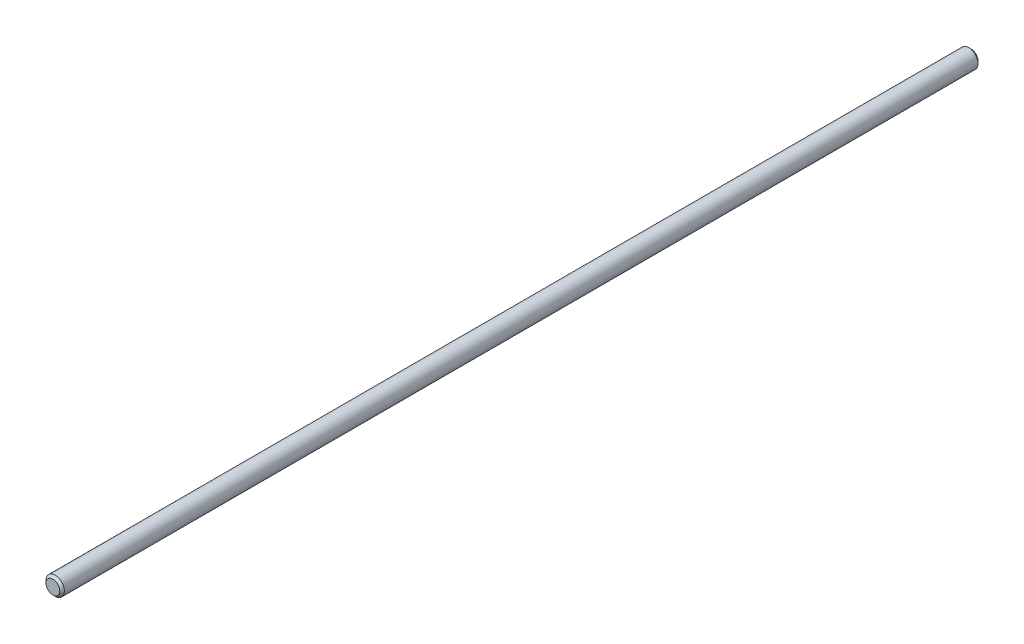
ISO-10303-21;
HEADER;
FILE_DESCRIPTION(('STEP AP214'),'2;1');
FILE_NAME('part.step','',(''),(''),'','','');
FILE_SCHEMA(('AUTOMOTIVE_DESIGN { 1 0 10303 214 1 1 1 1 }'));
ENDSEC;
DATA;
#1=APPLICATION_CONTEXT('core data for automotive mechanical design processes');
#2=APPLICATION_PROTOCOL_DEFINITION('international standard','automotive_design',2000,#1);
#3=PRODUCT_CONTEXT('',#1,'mechanical');
#4=PRODUCT('Part','Part','',(#3));
#5=PRODUCT_RELATED_PRODUCT_CATEGORY('part','',(#4));
#6=PRODUCT_DEFINITION_FORMATION('','',#4);
#7=PRODUCT_DEFINITION_CONTEXT('part definition',#1,'design');
#8=PRODUCT_DEFINITION('design','',#6,#7);
#9=PRODUCT_DEFINITION_SHAPE('','',#8);
#10=(LENGTH_UNIT() NAMED_UNIT(*) SI_UNIT(.MILLI.,.METRE.));
#11=(NAMED_UNIT(*) PLANE_ANGLE_UNIT() SI_UNIT($,.RADIAN.));
#12=(NAMED_UNIT(*) SI_UNIT($,.STERADIAN.) SOLID_ANGLE_UNIT());
#13=UNCERTAINTY_MEASURE_WITH_UNIT(LENGTH_MEASURE(1.E-05),#10,'distance_accuracy_value','');
#14=(GEOMETRIC_REPRESENTATION_CONTEXT(3) GLOBAL_UNCERTAINTY_ASSIGNED_CONTEXT((#13)) GLOBAL_UNIT_ASSIGNED_CONTEXT((#10,
#11,#12)) REPRESENTATION_CONTEXT('',''));
#15=CARTESIAN_POINT('',(0.,0.,0.));
#16=DIRECTION('',(0.,0.,1.));
#17=DIRECTION('',(1.,0.,0.));
#18=AXIS2_PLACEMENT_3D('',#15,#16,#17);
#19=CARTESIAN_POINT('',(0.,0.,-200.));
#20=DIRECTION('',(0.,0.,1.));
#21=DIRECTION('',(1.,0.,0.));
#22=AXIS2_PLACEMENT_3D('',#19,#20,#21);
#23=CYLINDRICAL_SURFACE('',#22,2.);
#24=CARTESIAN_POINT('',(0.,0.,-199.5));
#25=DIRECTION('',(0.,0.,1.));
#26=DIRECTION('',(1.,0.,0.));
#27=AXIS2_PLACEMENT_3D('',#24,#25,#26);
#28=CIRCLE('',#27,2.);
#29=CARTESIAN_POINT('',(2.,0.,-199.5));
#30=VERTEX_POINT('',#29);
#31=EDGE_CURVE('E43',#30,#30,#28,.T.);
#32=ORIENTED_EDGE('',*,*,#31,.T.);
#33=EDGE_LOOP('',(#32));
#34=FACE_BOUND('',#33,.T.);
#35=CARTESIAN_POINT('',(0.,0.,-0.5));
#36=DIRECTION('',(0.,0.,1.));
#37=DIRECTION('',(1.,0.,0.));
#38=AXIS2_PLACEMENT_3D('',#35,#36,#37);
#39=CIRCLE('',#38,2.);
#40=CARTESIAN_POINT('',(2.,0.,-0.5));
#41=VERTEX_POINT('',#40);
#42=EDGE_CURVE('E47',#41,#41,#39,.F.);
#43=ORIENTED_EDGE('',*,*,#42,.T.);
#44=EDGE_LOOP('',(#43));
#45=FACE_BOUND('',#44,.T.);
#46=ADVANCED_FACE('F32',(#34,#45),#23,.T.);
#47=CARTESIAN_POINT('',(0.,0.,-200.));
#48=DIRECTION('',(0.,0.,1.));
#49=DIRECTION('',(1.,0.,0.));
#50=AXIS2_PLACEMENT_3D('',#47,#48,#49);
#51=PLANE('',#50);
#52=CARTESIAN_POINT('',(0.,0.,-200.));
#53=DIRECTION('',(0.,0.,1.));
#54=DIRECTION('',(1.,0.,0.));
#55=AXIS2_PLACEMENT_3D('',#52,#53,#54);
#56=CIRCLE('',#55,1.5);
#57=CARTESIAN_POINT('',(1.5,0.,-200.));
#58=VERTEX_POINT('',#57);
#59=EDGE_CURVE('E39',#58,#58,#56,.F.);
#60=ORIENTED_EDGE('',*,*,#59,.T.);
#61=EDGE_LOOP('',(#60));
#62=FACE_BOUND('',#61,.T.);
#63=ADVANCED_FACE('F63',(#62),#51,.F.);
#64=CARTESIAN_POINT('',(0.,0.,0.));
#65=DIRECTION('',(0.,0.,1.));
#66=DIRECTION('',(1.,0.,0.));
#67=AXIS2_PLACEMENT_3D('',#64,#65,#66);
#68=PLANE('',#67);
#69=CARTESIAN_POINT('',(0.,0.,0.));
#70=DIRECTION('',(0.,0.,1.));
#71=DIRECTION('',(1.,0.,0.));
#72=AXIS2_PLACEMENT_3D('',#69,#70,#71);
#73=CIRCLE('',#72,1.5);
#74=CARTESIAN_POINT('',(1.5,0.,0.));
#75=VERTEX_POINT('',#74);
#76=EDGE_CURVE('E10',#75,#75,#73,.T.);
#77=ORIENTED_EDGE('',*,*,#76,.T.);
#78=EDGE_LOOP('',(#77));
#79=FACE_BOUND('',#78,.T.);
#80=ADVANCED_FACE('F60',(#79),#68,.T.);
#81=CARTESIAN_POINT('',(0.,0.,-199.5));
#82=DIRECTION('',(0.,0.,1.));
#83=DIRECTION('',(1.,0.,0.));
#84=AXIS2_PLACEMENT_3D('',#81,#82,#83);
#85=CONICAL_SURFACE('',#84,2.,0.785398163397447);
#86=ORIENTED_EDGE('',*,*,#59,.F.);
#87=EDGE_LOOP('',(#86));
#88=FACE_BOUND('',#87,.T.);
#89=ORIENTED_EDGE('',*,*,#31,.F.);
#90=EDGE_LOOP('',(#89));
#91=FACE_BOUND('',#90,.T.);
#92=ADVANCED_FACE('F56',(#88,#91),#85,.T.);
#93=CARTESIAN_POINT('',(0.,0.,0.));
#94=DIRECTION('',(0.,0.,-1.));
#95=DIRECTION('',(-1.,0.,0.));
#96=AXIS2_PLACEMENT_3D('',#93,#94,#95);
#97=CONICAL_SURFACE('',#96,1.5,0.785398163397447);
#98=ORIENTED_EDGE('',*,*,#42,.F.);
#99=EDGE_LOOP('',(#98));
#100=FACE_BOUND('',#99,.T.);
#101=ORIENTED_EDGE('',*,*,#76,.F.);
#102=EDGE_LOOP('',(#101));
#103=FACE_BOUND('',#102,.T.);
#104=ADVANCED_FACE('F34',(#100,#103),#97,.T.);
#105=CLOSED_SHELL('',(#46,#63,#80,#92,#104));
#106=MANIFOLD_SOLID_BREP('B2',#105);
#107=ADVANCED_BREP_SHAPE_REPRESENTATION('',(#18,#106),#14);
#108=SHAPE_DEFINITION_REPRESENTATION(#9,#107);
ENDSEC;
END-ISO-10303-21;
